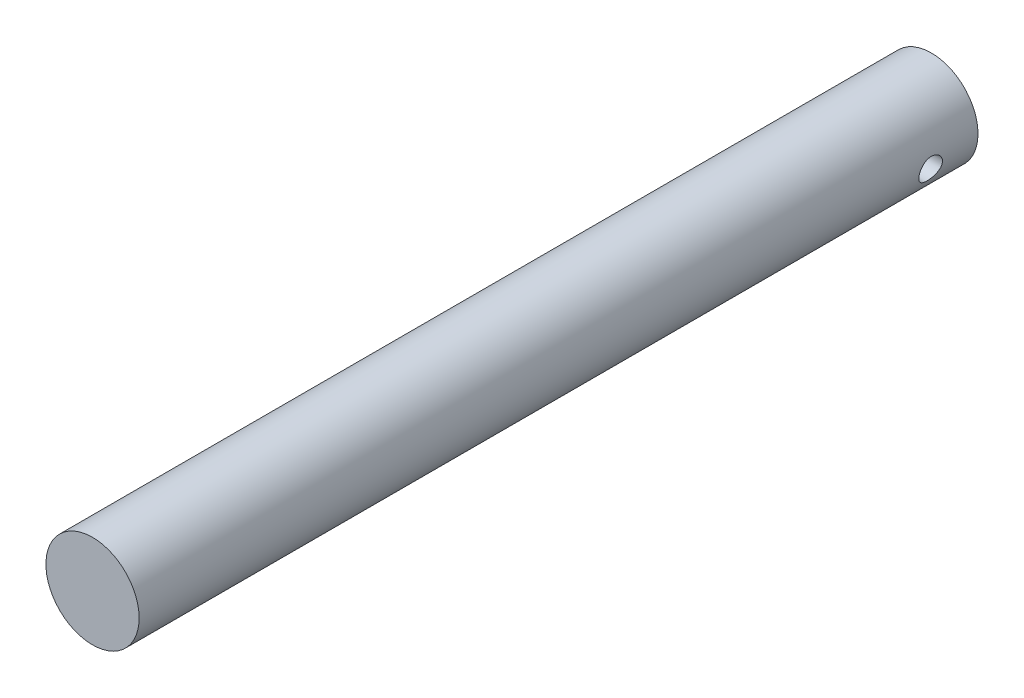
ISO-10303-21;
HEADER;
FILE_DESCRIPTION(('STEP AP214'),'2;1');
FILE_NAME('part.step','',(''),(''),'','','');
FILE_SCHEMA(('AUTOMOTIVE_DESIGN { 1 0 10303 214 1 1 1 1 }'));
ENDSEC;
DATA;
#1=APPLICATION_CONTEXT('core data for automotive mechanical design processes');
#2=APPLICATION_PROTOCOL_DEFINITION('international standard','automotive_design',2000,#1);
#3=PRODUCT_CONTEXT('',#1,'mechanical');
#4=PRODUCT('Part','Part','',(#3));
#5=PRODUCT_RELATED_PRODUCT_CATEGORY('part','',(#4));
#6=PRODUCT_DEFINITION_FORMATION('','',#4);
#7=PRODUCT_DEFINITION_CONTEXT('part definition',#1,'design');
#8=PRODUCT_DEFINITION('design','',#6,#7);
#9=PRODUCT_DEFINITION_SHAPE('','',#8);
#10=(LENGTH_UNIT() NAMED_UNIT(*) SI_UNIT(.MILLI.,.METRE.));
#11=(NAMED_UNIT(*) PLANE_ANGLE_UNIT() SI_UNIT($,.RADIAN.));
#12=(NAMED_UNIT(*) SI_UNIT($,.STERADIAN.) SOLID_ANGLE_UNIT());
#13=UNCERTAINTY_MEASURE_WITH_UNIT(LENGTH_MEASURE(1.E-05),#10,'distance_accuracy_value','');
#14=(GEOMETRIC_REPRESENTATION_CONTEXT(3) GLOBAL_UNCERTAINTY_ASSIGNED_CONTEXT((#13)) GLOBAL_UNIT_ASSIGNED_CONTEXT((#10,
#11,#12)) REPRESENTATION_CONTEXT('',''));
#15=CARTESIAN_POINT('',(0.,0.,0.));
#16=DIRECTION('',(0.,0.,1.));
#17=DIRECTION('',(1.,0.,0.));
#18=AXIS2_PLACEMENT_3D('',#15,#16,#17);
#19=CARTESIAN_POINT('',(-5.14667319358944,5.63352065784791,114.3));
#20=DIRECTION('',(0.,0.,-1.));
#21=DIRECTION('',(-1.,0.,0.));
#22=AXIS2_PLACEMENT_3D('',#19,#20,#21);
#23=CYLINDRICAL_SURFACE('',#22,6.35);
#24=CARTESIAN_POINT('',(-11.4966731935894,5.63352065784791,7.49416085311672));
#25=CARTESIAN_POINT('',(-11.4966723187887,5.57037438197566,7.55489347815813));
#26=CARTESIAN_POINT('',(-11.4957270361816,5.50217135851669,7.61040345767334));
#27=CARTESIAN_POINT('',(-11.4910870365069,5.35758857520538,7.7093971418426));
#28=CARTESIAN_POINT('',(-11.4873914090601,5.28120611508337,7.75287685787501));
#29=CARTESIAN_POINT('',(-11.4765765584074,5.12249936446053,7.82660163877238));
#30=CARTESIAN_POINT('',(-11.4694566173724,5.04017383120702,7.85684392617307));
#31=CARTESIAN_POINT('',(-11.4514204694626,4.87207287585937,7.90332524242942));
#32=CARTESIAN_POINT('',(-11.4405046842929,4.78629783792903,7.919565826129));
#33=CARTESIAN_POINT('',(-11.4149235092355,4.61416885713914,7.93777704138784));
#34=CARTESIAN_POINT('',(-11.4002734560291,4.52781865639444,7.93980509574612));
#35=CARTESIAN_POINT('',(-11.3675659233832,4.35657191103384,7.92999176524293));
#36=CARTESIAN_POINT('',(-11.3495079563011,4.27167557635208,7.9181483942376));
#37=CARTESIAN_POINT('',(-11.3101394593704,4.10320315662077,7.88070048731493));
#38=CARTESIAN_POINT('',(-11.2887534693915,4.01972671190518,7.85472838298056));
#39=CARTESIAN_POINT('',(-11.2441316628234,3.85855504981968,7.78971528359231));
#40=CARTESIAN_POINT('',(-11.2208953140074,3.78086150833406,7.75067051796885));
#41=CARTESIAN_POINT('',(-11.1726644411309,3.6293869961561,7.65836034783207));
#42=CARTESIAN_POINT('',(-11.1476393934426,3.55598060723576,7.60449520488998));
#43=CARTESIAN_POINT('',(-11.098538680847,3.41922955322537,7.48482843762937));
#44=CARTESIAN_POINT('',(-11.0744632770236,3.35588764084719,7.41902355820586));
#45=CARTESIAN_POINT('',(-11.0287142819315,3.24019138728564,7.27589430024804));
#46=CARTESIAN_POINT('',(-11.0070808625101,3.18801085691329,7.19841584601569));
#47=CARTESIAN_POINT('',(-10.9685711845052,3.09769183749287,7.03458752301014));
#48=CARTESIAN_POINT('',(-10.9516924232106,3.05954595777178,6.94824235419687));
#49=CARTESIAN_POINT('',(-10.9252999270454,3.00085062604232,6.77474164868238));
#50=CARTESIAN_POINT('',(-10.9153959014436,2.97936038857456,6.68796508786724));
#51=CARTESIAN_POINT('',(-10.9023883551584,2.95126529681282,6.51155467632514));
#52=CARTESIAN_POINT('',(-10.8992805008916,2.94465095681562,6.42192268338684));
#53=CARTESIAN_POINT('',(-10.9001655827472,2.94654890047828,6.25014135128364));
#54=CARTESIAN_POINT('',(-10.9036045864826,2.95388111600075,6.16797309703434));
#55=CARTESIAN_POINT('',(-10.9161726437241,2.98105066827483,6.00618982507845));
#56=CARTESIAN_POINT('',(-10.9253018337739,3.00088830511107,5.92657486868992));
#57=CARTESIAN_POINT('',(-10.9484031842532,3.05220114786127,5.77218443072269));
#58=CARTESIAN_POINT('',(-10.9623635178003,3.08364794640122,5.69739765518667));
#59=CARTESIAN_POINT('',(-10.994025502275,3.15711875061437,5.55408531921933));
#60=CARTESIAN_POINT('',(-11.011728235194,3.19914581589462,5.48556157776198));
#61=CARTESIAN_POINT('',(-11.0510864580475,3.29614224618553,5.3511982085139));
#62=CARTESIAN_POINT('',(-11.0729390310796,3.35184692745849,5.28594738164198));
#63=CARTESIAN_POINT('',(-11.1180697153176,3.47271418174792,5.1654540063165));
#64=CARTESIAN_POINT('',(-11.1413484047902,3.53788060621608,5.11021555413848));
#65=CARTESIAN_POINT('',(-11.1896069858309,3.6811988185456,5.00729875468108));
#66=CARTESIAN_POINT('',(-11.2145889049439,3.75994725285996,4.96044904223258));
#67=CARTESIAN_POINT('',(-11.2630319025384,3.92471261328099,4.88082927829559));
#68=CARTESIAN_POINT('',(-11.2864928803943,4.01073001943758,4.8480601575739));
#69=CARTESIAN_POINT('',(-11.3306779950019,4.18819297113962,4.79765511650825));
#70=CARTESIAN_POINT('',(-11.3513904182744,4.27965948405439,4.78008230859097));
#71=CARTESIAN_POINT('',(-11.3889538269772,4.46503286123768,4.76122622554598));
#72=CARTESIAN_POINT('',(-11.4058060734509,4.55893891736187,4.75993762321753));
#73=CARTESIAN_POINT('',(-11.4344022591172,4.74181808609845,4.77374385360627));
#74=CARTESIAN_POINT('',(-11.4463475573342,4.83081725095028,4.78807844139585));
#75=CARTESIAN_POINT('',(-11.4661541321803,5.00551813485197,4.83176907499863));
#76=CARTESIAN_POINT('',(-11.4740162011944,5.09122049068419,4.86112220414095));
#77=CARTESIAN_POINT('',(-11.4858140691431,5.25376164131267,4.93283988232801));
#78=CARTESIAN_POINT('',(-11.4898747779332,5.33080317573103,4.97472587392724));
#79=CARTESIAN_POINT('',(-11.49516611838,5.47700999278149,5.07065401475228));
#80=CARTESIAN_POINT('',(-11.4963967091549,5.54617516162381,5.12469633956694));
#81=CARTESIAN_POINT('',(-11.4968662694319,5.67483734219238,5.24358488458981));
#82=CARTESIAN_POINT('',(-11.4960999350937,5.73430816019136,5.30845944720192));
#83=CARTESIAN_POINT('',(-11.4934869834877,5.84172567120558,5.4471172990762));
#84=CARTESIAN_POINT('',(-11.4916402848064,5.88967149534209,5.52090125939555));
#85=CARTESIAN_POINT('',(-11.4877148382777,5.97334209897054,5.67649534305195));
#86=CARTESIAN_POINT('',(-11.4856330949367,6.00887813792548,5.75840696073152));
#87=CARTESIAN_POINT('',(-11.482010693444,6.06574314219652,5.92703187201716));
#88=CARTESIAN_POINT('',(-11.4804700297487,6.08707225306559,6.01374511641968));
#89=CARTESIAN_POINT('',(-11.4784122864904,6.1149555067454,6.18977933116071));
#90=CARTESIAN_POINT('',(-11.4778980900027,6.12146804083937,6.27910693349739));
#91=CARTESIAN_POINT('',(-11.4780567235715,6.11940480518196,6.45759509263565));
#92=CARTESIAN_POINT('',(-11.4787296582729,6.11082770528731,6.54675563401736));
#93=CARTESIAN_POINT('',(-11.4810566218672,6.07887305879734,6.72214637998496));
#94=CARTESIAN_POINT('',(-11.4827083219822,6.05553063449762,6.80838302816648));
#95=CARTESIAN_POINT('',(-11.4864631841992,5.99474601449732,6.97569497556071));
#96=CARTESIAN_POINT('',(-11.4885661506659,5.95730992346813,7.0567724917017));
#97=CARTESIAN_POINT('',(-11.4921647131725,5.87569757927797,7.20044434564163));
#98=CARTESIAN_POINT('',(-11.493704158091,5.83324654319423,7.26402494075027));
#99=CARTESIAN_POINT('',(-11.4959587682352,5.73964823185501,7.38444360595702));
#100=CARTESIAN_POINT('',(-11.4966739552655,5.68850118668075,7.44128185437832));
#101=CARTESIAN_POINT('',(-11.4966731935894,5.63352065784791,7.49416085311672));
#102=B_SPLINE_CURVE_WITH_KNOTS('',3,(#24,#25,#26,#27,#28,#29,#30,#31,#32,#33,#34,#35,#36,#37,
#38,#39,#40,#41,#42,#43,#44,#45,#46,#47,#48,#49,#50,#51,#52,#53,#54,#55,#56,#57,#58,#59,#60,#61,
#62,#63,#64,#65,#66,#67,#68,#69,#70,#71,#72,#73,#74,#75,#76,#77,#78,#79,#80,#81,#82,#83,#84,#85,
#86,#87,#88,#89,#90,#91,#92,#93,#94,#95,#96,#97,#98,#99,#100,#101),.UNSPECIFIED.,.T.,.F.,(4,2,2,
2,2,2,2,2,2,2,2,2,2,2,2,2,2,2,2,2,2,2,2,2,2,2,2,2,2,2,2,2,2,2,2,2,2,2,4),(0.,0.262568410603401,
0.525223771464898,0.78793421603007,1.05061548369084,1.31223482669342,1.57389163355911,
1.84270594461646,2.11159785712554,2.39357952507985,2.67563818492569,2.96181249097875,
3.24783588068243,3.51620490210032,3.7844027478612,4.03091075496965,4.27742467759878,
4.52333934152322,4.76932520103024,5.03379880011908,5.29838035795488,5.5819768305169,
5.86559204672218,6.15037957639931,6.43507393852094,6.70650898079199,6.97789132910702,
7.24000623813216,7.50212493344799,7.76494052611796,8.02777592646063,8.2944505211145,
8.56112238358885,8.82854220895533,9.09598560841906,9.36279522000213,9.629489395728,
9.85810987692616,10.0867243101665),.UNSPECIFIED.);
#103=CARTESIAN_POINT('',(-11.4966731935894,5.63352065784791,7.49416085311672));
#104=VERTEX_POINT('',#103);
#105=EDGE_CURVE('E35',#104,#104,#102,.T.);
#106=ORIENTED_EDGE('',*,*,#105,.T.);
#107=EDGE_LOOP('',(#106));
#108=FACE_BOUND('',#107,.T.);
#109=CARTESIAN_POINT('',(1.1072414051083,4.53304249259645,4.7625));
#110=CARTESIAN_POINT('',(1.09122646814378,4.44204509262642,4.76250346867888));
#111=CARTESIAN_POINT('',(1.07320167595344,4.35135730880226,4.77035093673339));
#112=CARTESIAN_POINT('',(1.03382490744758,4.17328537724596,4.80115657140449));
#113=CARTESIAN_POINT('',(1.01246945230057,4.08590480379701,4.82413061928369));
#114=CARTESIAN_POINT('',(0.967542499557475,3.91698652906554,4.88417349032057));
#115=CARTESIAN_POINT('',(0.94397609547645,3.83543612531691,4.92121048817993));
#116=CARTESIAN_POINT('',(0.89588725211764,3.67990936940804,5.0082603145581));
#117=CARTESIAN_POINT('',(0.871364798098768,3.60593313409576,5.05827334321824));
#118=CARTESIAN_POINT('',(0.822055250803726,3.46498658658739,5.17191915751116));
#119=CARTESIAN_POINT('',(0.797286010302209,3.39832698319269,5.23594602145988));
#120=CARTESIAN_POINT('',(0.750136905679293,3.27674500434865,5.37511122084521));
#121=CARTESIAN_POINT('',(0.727757203335317,3.22182342333956,5.45025030778543));
#122=CARTESIAN_POINT('',(0.687590668542176,3.12622622722873,5.60874064079037));
#123=CARTESIAN_POINT('',(0.669743990972279,3.08536215314509,5.6919623678467));
#124=CARTESIAN_POINT('',(0.640015083971412,3.01854603899386,5.86517557963188));
#125=CARTESIAN_POINT('',(0.628128278781309,2.99258255660705,5.95516180960692));
#126=CARTESIAN_POINT('',(0.612327893998627,2.9583134499716,6.13142114060457));
#127=CARTESIAN_POINT('',(0.607841975226183,2.94873788202349,6.21739646423749));
#128=CARTESIAN_POINT('',(0.605490825164703,2.94370260465277,6.38983715218394));
#129=CARTESIAN_POINT('',(0.607623267582644,2.94823793538057,6.47630233365271));
#130=CARTESIAN_POINT('',(0.617960845186541,2.97051000896884,6.64193084793489));
#131=CARTESIAN_POINT('',(0.625803201477929,2.98745845161977,6.72122533153763));
#132=CARTESIAN_POINT('',(0.646441947844743,3.03295609815832,6.87572316178019));
#133=CARTESIAN_POINT('',(0.659239089812233,3.06150706276908,6.95092588551628));
#134=CARTESIAN_POINT('',(0.689272151648969,3.13038380448666,7.09801474119744));
#135=CARTESIAN_POINT('',(0.706645243866464,3.17107980702443,7.16969869120877));
#136=CARTESIAN_POINT('',(0.744309047341906,3.26259812759627,7.3054233114813));
#137=CARTESIAN_POINT('',(0.764600825104074,3.31342414982652,7.36946117209571));
#138=CARTESIAN_POINT('',(0.808587120221362,3.42864350733972,7.49378070264535));
#139=CARTESIAN_POINT('',(0.832424278033494,3.49382083678567,7.55328635935644));
#140=CARTESIAN_POINT('',(0.880432323593931,3.63304055638174,7.6606819902985));
#141=CARTESIAN_POINT('',(0.90460332119193,3.70708592915074,7.70856803998896));
#142=CARTESIAN_POINT('',(0.953029249712342,3.8662140106638,7.79361616636954));
#143=CARTESIAN_POINT('',(0.977229139864805,3.95166159045859,7.8301302713165));
#144=CARTESIAN_POINT('',(1.02300954395728,4.12825467201055,7.88783199682545));
#145=CARTESIAN_POINT('',(1.04459041761952,4.21939938865391,7.90902172417979));
#146=CARTESIAN_POINT('',(1.08359757246187,4.40274340102788,7.93478881437266));
#147=CARTESIAN_POINT('',(1.10110516492621,4.49487481880317,7.93972313313152));
#148=CARTESIAN_POINT('',(1.13191489685872,4.67928723819028,7.93343686152147));
#149=CARTESIAN_POINT('',(1.14521838869269,4.77156818208231,7.92222147261873));
#150=CARTESIAN_POINT('',(1.16690662367232,4.94882860704266,7.88462919079109));
#151=CARTESIAN_POINT('',(1.17549881005058,5.03394506046446,7.85901480534167));
#152=CARTESIAN_POINT('',(1.18898040670508,5.19895362335223,7.79380940094967));
#153=CARTESIAN_POINT('',(1.19387018703741,5.27884625421062,7.75421977941427));
#154=CARTESIAN_POINT('',(1.20048851329302,5.42949898373796,7.66305994171328));
#155=CARTESIAN_POINT('',(1.20227614476715,5.50040536756824,7.61173522120677));
#156=CARTESIAN_POINT('',(1.2036727076274,5.63284348440511,7.49813169378299));
#157=CARTESIAN_POINT('',(1.20328151295711,5.69437467479645,7.4358522532801));
#158=CARTESIAN_POINT('',(1.20120987680101,5.80700912550126,7.30128929132666));
#159=CARTESIAN_POINT('',(1.19951479193679,5.85798554034691,7.22889983861513));
#160=CARTESIAN_POINT('',(1.1957314437491,5.94721677196298,7.07667210570439));
#161=CARTESIAN_POINT('',(1.19364315925818,5.9854709035365,6.99683342460099));
#162=CARTESIAN_POINT('',(1.18982925709913,6.04855496465072,6.83097545673009));
#163=CARTESIAN_POINT('',(1.18810797558995,6.07322931428755,6.74489682990319));
#164=CARTESIAN_POINT('',(1.18561551481244,6.10778176634603,6.56980669208562));
#165=CARTESIAN_POINT('',(1.18484432162763,6.11766008549395,6.48079522407354));
#166=CARTESIAN_POINT('',(1.18448538310661,6.12233250860828,6.30248444004885));
#167=CARTESIAN_POINT('',(1.18489618186778,6.11714516942213,6.21318561336761));
#168=CARTESIAN_POINT('',(1.18677511993297,6.09187648134939,6.03673204286365));
#169=CARTESIAN_POINT('',(1.18824327571946,6.07179490028569,5.9495773324861));
#170=CARTESIAN_POINT('',(1.19177519318108,6.01733110236309,5.77993412579503));
#171=CARTESIAN_POINT('',(1.1938385686424,5.98295815222966,5.69744264507888));
#172=CARTESIAN_POINT('',(1.19782835120313,5.90087924797479,5.53937714465992));
#173=CARTESIAN_POINT('',(1.19975475547396,5.85317301860961,5.46380326780249));
#174=CARTESIAN_POINT('',(1.20256487162185,5.74562789264799,5.32152310851872));
#175=CARTESIAN_POINT('',(1.20344598713964,5.68575921589271,5.25483927053775));
#176=CARTESIAN_POINT('',(1.20318178286641,5.55566164520703,5.1324699099218));
#177=CARTESIAN_POINT('',(1.20203635448334,5.48543219628111,5.07678497683917));
#178=CARTESIAN_POINT('',(1.1968431576609,5.33730945510758,4.97844984065804));
#179=CARTESIAN_POINT('',(1.19281946701471,5.25948433728414,4.93569566081485));
#180=CARTESIAN_POINT('',(1.18122638071143,5.09806590496273,4.86383153183957));
#181=CARTESIAN_POINT('',(1.17365985984827,5.01447731398568,4.83471055842367));
#182=CARTESIAN_POINT('',(1.15691226591447,4.86436861291053,4.79601003954217));
#183=CARTESIAN_POINT('',(1.14854206415544,4.79851233573932,4.7834313350946));
#184=CARTESIAN_POINT('',(1.12955208521855,4.6660632143787,4.76667497309683));
#185=CARTESIAN_POINT('',(1.11893226725551,4.59947035685595,4.76249746787348));
#186=CARTESIAN_POINT('',(1.1072414051083,4.53304249259645,4.7625));
#187=B_SPLINE_CURVE_WITH_KNOTS('',3,(#109,#110,#111,#112,#113,#114,#115,#116,#117,#118,#119,
#120,#121,#122,#123,#124,#125,#126,#127,#128,#129,#130,#131,#132,#133,#134,#135,#136,#137,#138,
#139,#140,#141,#142,#143,#144,#145,#146,#147,#148,#149,#150,#151,#152,#153,#154,#155,#156,#157,
#158,#159,#160,#161,#162,#163,#164,#165,#166,#167,#168,#169,#170,#171,#172,#173,#174,#175,#176,
#177,#178,#179,#180,#181,#182,#183,#184,#185,#186),.UNSPECIFIED.,.T.,.F.,(4,2,2,2,2,2,2,2,2,2,2,
2,2,2,2,2,2,2,2,2,2,2,2,2,2,2,2,2,2,2,2,2,2,2,2,2,2,2,4),(0.,0.276930620541383,
0.554152452704454,0.830750618769554,1.10735305131786,1.39305899565573,1.67878427071769,
1.96051433594964,2.24202776725893,2.50052895790662,2.75893929805718,3.00222328905003,
3.24554421303138,3.49720953979206,3.74896706121414,4.0220217208615,4.29516847717805,
4.58183250565638,4.86845711612602,5.14874417882507,5.42894098740609,5.69553457484588,
5.96210151269534,6.22353311343854,6.48497983951563,6.74940640571732,7.01384721110308,
7.28125771960581,7.54866431114913,7.81574166928594,8.08282319081375,8.34973180232663,
8.61664592413806,8.88422164646433,9.15181170722848,9.4171890636698,9.6823514545224,
9.88450641872165,10.0866650482724),.UNSPECIFIED.);
#188=CARTESIAN_POINT('',(1.1072414051083,4.53304249259645,4.7625));
#189=VERTEX_POINT('',#188);
#190=EDGE_CURVE('E10',#189,#189,#187,.T.);
#191=ORIENTED_EDGE('',*,*,#190,.T.);
#192=EDGE_LOOP('',(#191));
#193=FACE_BOUND('',#192,.T.);
#194=CARTESIAN_POINT('',(-5.14667319358944,5.63352065784791,114.3));
#195=DIRECTION('',(0.,0.,1.));
#196=DIRECTION('',(1.,0.,0.));
#197=AXIS2_PLACEMENT_3D('',#194,#195,#196);
#198=CIRCLE('',#197,6.35);
#199=CARTESIAN_POINT('',(1.20332680641056,5.63352065784791,114.3));
#200=VERTEX_POINT('',#199);
#201=EDGE_CURVE('E42',#200,#200,#198,.T.);
#202=ORIENTED_EDGE('',*,*,#201,.F.);
#203=EDGE_LOOP('',(#202));
#204=FACE_BOUND('',#203,.T.);
#205=CARTESIAN_POINT('',(-5.14667319358944,5.63352065784791,0.));
#206=DIRECTION('',(0.,0.,1.));
#207=DIRECTION('',(1.,0.,0.));
#208=AXIS2_PLACEMENT_3D('',#205,#206,#207);
#209=CIRCLE('',#208,6.35);
#210=CARTESIAN_POINT('',(1.20332680641056,5.63352065784791,0.));
#211=VERTEX_POINT('',#210);
#212=EDGE_CURVE('E46',#211,#211,#209,.T.);
#213=ORIENTED_EDGE('',*,*,#212,.T.);
#214=EDGE_LOOP('',(#213));
#215=FACE_BOUND('',#214,.T.);
#216=ADVANCED_FACE('F31',(#108,#193,#204,#215),#23,.T.);
#217=CARTESIAN_POINT('',(-5.14667319358944,5.63352065784791,114.3));
#218=DIRECTION('',(0.,0.,1.));
#219=DIRECTION('',(1.,0.,0.));
#220=AXIS2_PLACEMENT_3D('',#217,#218,#219);
#221=PLANE('',#220);
#222=ORIENTED_EDGE('',*,*,#201,.T.);
#223=EDGE_LOOP('',(#222));
#224=FACE_BOUND('',#223,.T.);
#225=ADVANCED_FACE('F57',(#224),#221,.T.);
#226=CARTESIAN_POINT('',(-5.14667319358944,5.63352065784791,0.));
#227=DIRECTION('',(0.,0.,1.));
#228=DIRECTION('',(1.,0.,0.));
#229=AXIS2_PLACEMENT_3D('',#226,#227,#228);
#230=PLANE('',#229);
#231=ORIENTED_EDGE('',*,*,#212,.F.);
#232=EDGE_LOOP('',(#231));
#233=FACE_BOUND('',#232,.T.);
#234=ADVANCED_FACE('F55',(#233),#230,.F.);
#235=CARTESIAN_POINT('',(-21.9106731935894,4.53304249259645,6.35));
#236=DIRECTION('',(1.,0.,0.));
#237=DIRECTION('',(0.,0.,-1.));
#238=AXIS2_PLACEMENT_3D('',#235,#236,#237);
#239=CYLINDRICAL_SURFACE('',#238,1.5875);
#240=ORIENTED_EDGE('',*,*,#190,.F.);
#241=EDGE_LOOP('',(#240));
#242=FACE_BOUND('',#241,.T.);
#243=ORIENTED_EDGE('',*,*,#105,.F.);
#244=EDGE_LOOP('',(#243));
#245=FACE_BOUND('',#244,.T.);
#246=ADVANCED_FACE('F51',(#242,#245),#239,.F.);
#247=CLOSED_SHELL('',(#216,#225,#234,#246));
#248=MANIFOLD_SOLID_BREP('B2',#247);
#249=ADVANCED_BREP_SHAPE_REPRESENTATION('',(#18,#248),#14);
#250=SHAPE_DEFINITION_REPRESENTATION(#9,#249);
ENDSEC;
END-ISO-10303-21;
